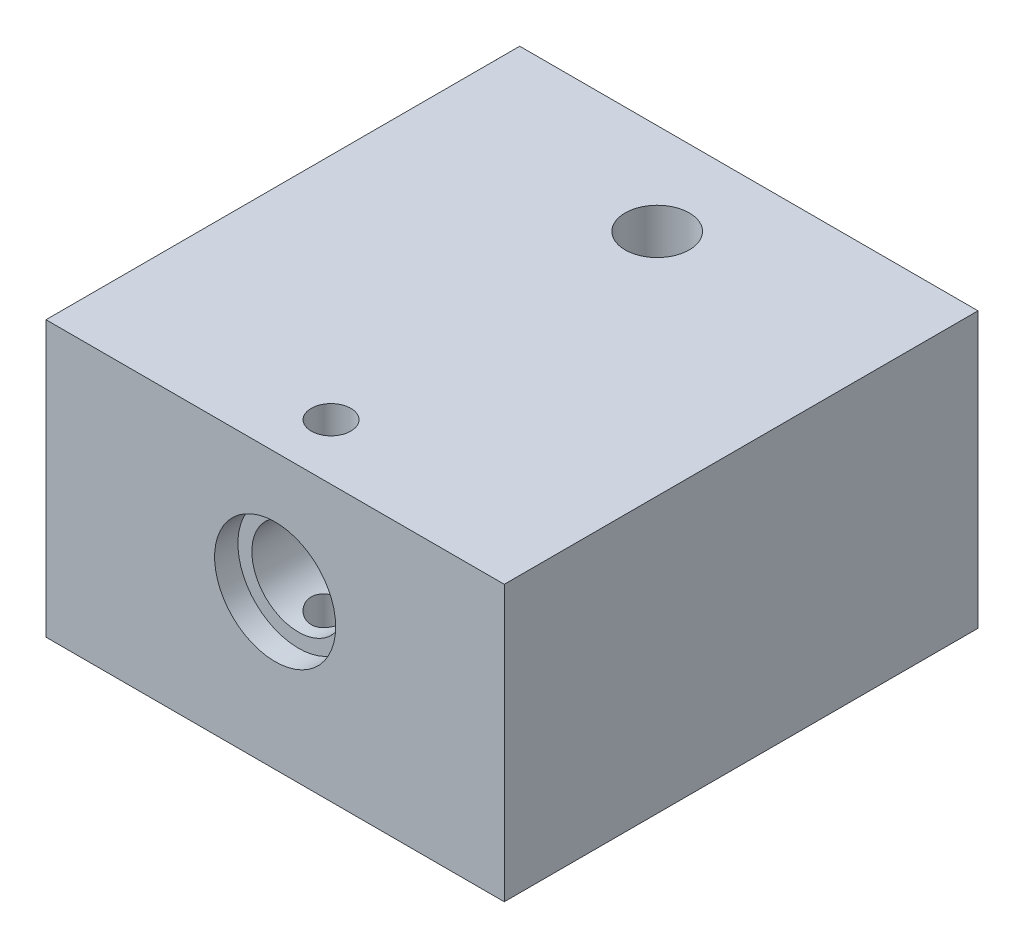
ISO-10303-21;
HEADER;
FILE_DESCRIPTION(('STEP AP214'),'2;1');
FILE_NAME('part.step','',(''),(''),'','','');
FILE_SCHEMA(('AUTOMOTIVE_DESIGN { 1 0 10303 214 1 1 1 1 }'));
ENDSEC;
DATA;
#1=APPLICATION_CONTEXT('core data for automotive mechanical design processes');
#2=APPLICATION_PROTOCOL_DEFINITION('international standard','automotive_design',2000,#1);
#3=PRODUCT_CONTEXT('',#1,'mechanical');
#4=PRODUCT('Part','Part','',(#3));
#5=PRODUCT_RELATED_PRODUCT_CATEGORY('part','',(#4));
#6=PRODUCT_DEFINITION_FORMATION('','',#4);
#7=PRODUCT_DEFINITION_CONTEXT('part definition',#1,'design');
#8=PRODUCT_DEFINITION('design','',#6,#7);
#9=PRODUCT_DEFINITION_SHAPE('','',#8);
#10=(LENGTH_UNIT() NAMED_UNIT(*) SI_UNIT(.MILLI.,.METRE.));
#11=(NAMED_UNIT(*) PLANE_ANGLE_UNIT() SI_UNIT($,.RADIAN.));
#12=(NAMED_UNIT(*) SI_UNIT($,.STERADIAN.) SOLID_ANGLE_UNIT());
#13=UNCERTAINTY_MEASURE_WITH_UNIT(LENGTH_MEASURE(1.E-05),#10,'distance_accuracy_value','');
#14=(GEOMETRIC_REPRESENTATION_CONTEXT(3) GLOBAL_UNCERTAINTY_ASSIGNED_CONTEXT((#13)) GLOBAL_UNIT_ASSIGNED_CONTEXT((#10,
#11,#12)) REPRESENTATION_CONTEXT('',''));
#15=CARTESIAN_POINT('',(0.,0.,0.));
#16=DIRECTION('',(0.,0.,1.));
#17=DIRECTION('',(1.,0.,0.));
#18=AXIS2_PLACEMENT_3D('',#15,#16,#17);
#19=CARTESIAN_POINT('',(-70.2377282776494,8.396,-56.7765959430233));
#20=DIRECTION('',(0.,0.,1.));
#21=DIRECTION('',(1.,0.,0.));
#22=AXIS2_PLACEMENT_3D('',#19,#20,#21);
#23=CYLINDRICAL_SURFACE('',#22,2.54);
#24=CARTESIAN_POINT('',(-70.2377282776494,5.85600000000001,-52.9030959430234));
#25=CARTESIAN_POINT('',(-70.2954540565278,5.85600494920879,-52.9031024767732));
#26=CARTESIAN_POINT('',(-70.3532654148404,5.85799049875809,-52.9077535295618));
#27=CARTESIAN_POINT('',(-70.4672451017373,5.86574176406517,-52.9261901695404));
#28=CARTESIAN_POINT('',(-70.5234088567018,5.87151712185038,-52.939999057043));
#29=CARTESIAN_POINT('',(-70.6322559483225,5.88622853633754,-52.976144809449));
#30=CARTESIAN_POINT('',(-70.6849505430987,5.89515370349126,-52.9984523137267));
#31=CARTESIAN_POINT('',(-70.7857967734474,5.91530072325419,-53.050838400811));
#32=CARTESIAN_POINT('',(-70.833949678348,5.92652193136205,-53.080914803499));
#33=CARTESIAN_POINT('',(-70.9269184608487,5.95079373890104,-53.1496286471514));
#34=CARTESIAN_POINT('',(-70.9714683660826,5.96390580222069,-53.1886040243645));
#35=CARTESIAN_POINT('',(-71.053629780163,5.99022163397866,-53.2732941637497));
#36=CARTESIAN_POINT('',(-71.0912374977554,6.00342544846394,-53.3190125840468));
#37=CARTESIAN_POINT('',(-71.1603700325742,6.02919524400095,-53.4187519693264));
#38=CARTESIAN_POINT('',(-71.1914801481277,6.04169301809848,-53.4730798659445));
#39=CARTESIAN_POINT('',(-71.2440016839835,6.06365562848929,-53.5868043819622));
#40=CARTESIAN_POINT('',(-71.2654182990281,6.07312208846476,-53.6461982661707));
#41=CARTESIAN_POINT('',(-71.2968353168137,6.0872822427673,-53.7653069340825));
#42=CARTESIAN_POINT('',(-71.3073487203862,6.09218914827286,-53.8248600535432));
#43=CARTESIAN_POINT('',(-71.318260031115,6.09728485738802,-53.9450716504944));
#44=CARTESIAN_POINT('',(-71.3186638460096,6.09747641650251,-54.0057294616943));
#45=CARTESIAN_POINT('',(-71.3097297541824,6.0932994842892,-54.1212210328693));
#46=CARTESIAN_POINT('',(-71.3011721731047,6.08929624305789,-54.1761310659081));
#47=CARTESIAN_POINT('',(-71.2758711000014,6.07780016063501,-54.2836457653623));
#48=CARTESIAN_POINT('',(-71.2591259644517,6.07030661883428,-54.3362499666068));
#49=CARTESIAN_POINT('',(-71.2175960458496,6.05250323019407,-54.4390154129461));
#50=CARTESIAN_POINT('',(-71.1926449059221,6.04213587255303,-54.4890990161583));
#51=CARTESIAN_POINT('',(-71.1355293873418,6.01976508174873,-54.5845683931012));
#52=CARTESIAN_POINT('',(-71.1033621015108,6.00776098995884,-54.6299522626433));
#53=CARTESIAN_POINT('',(-71.0293963948401,5.98218104392929,-54.7189502224163));
#54=CARTESIAN_POINT('',(-70.9869984917964,5.9685599779342,-54.7620545402123));
#55=CARTESIAN_POINT('',(-70.8954464717291,5.94217137358584,-54.8407162353623));
#56=CARTESIAN_POINT('',(-70.846290648008,5.92940405205832,-54.8762717004812));
#57=CARTESIAN_POINT('',(-70.7410155934028,5.90576310679323,-54.9396155749312));
#58=CARTESIAN_POINT('',(-70.6847534774818,5.89494453704248,-54.9671885962195));
#59=CARTESIAN_POINT('',(-70.5678117776416,5.87684609683171,-55.01229797408));
#60=CARTESIAN_POINT('',(-70.507134759068,5.86956418992569,-55.0298401075729));
#61=CARTESIAN_POINT('',(-70.3873388566134,5.85974473766644,-55.0533042151602));
#62=CARTESIAN_POINT('',(-70.3283767081008,5.85692858565955,-55.0599098168799));
#63=CARTESIAN_POINT('',(-70.2101236020373,5.85546262160095,-55.0633614204787));
#64=CARTESIAN_POINT('',(-70.1508327491963,5.85681155120561,-55.0602103700113));
#65=CARTESIAN_POINT('',(-70.0368599175699,5.863344538528,-55.0447203005117));
#66=CARTESIAN_POINT('',(-69.9820987300059,5.86832519075056,-55.0328683693606));
#67=CARTESIAN_POINT('',(-69.8754063884471,5.88139992359614,-55.0009987019312));
#68=CARTESIAN_POINT('',(-69.8234755892225,5.88949439349531,-54.9809799446524));
#69=CARTESIAN_POINT('',(-69.7220864853712,5.90833912047801,-54.9326934775513));
#70=CARTESIAN_POINT('',(-69.6727558425664,5.91916434677151,-54.9041879260995));
#71=CARTESIAN_POINT('',(-69.5794006076113,5.94232484236627,-54.8399974549462));
#72=CARTESIAN_POINT('',(-69.535378279594,5.95466075152289,-54.80430948896));
#73=CARTESIAN_POINT('',(-69.4504526045736,5.98065050656283,-54.7236727892713));
#74=CARTESIAN_POINT('',(-69.41002310147,5.99433422391665,-54.6782333734531));
#75=CARTESIAN_POINT('',(-69.3372230093117,6.02066999801151,-54.5810101575556));
#76=CARTESIAN_POINT('',(-69.3048545333148,6.03332178366637,-54.5292246992686));
#77=CARTESIAN_POINT('',(-69.2486641679409,6.05627933101312,-54.4195508625652));
#78=CARTESIAN_POINT('',(-69.2249949523224,6.0665421214838,-54.3615745912061));
#79=CARTESIAN_POINT('',(-69.1879639614265,6.08299048876205,-54.2418840818804));
#80=CARTESIAN_POINT('',(-69.1745932218376,6.08917961081131,-54.180173145344));
#81=CARTESIAN_POINT('',(-69.1594463432196,6.09622361078056,-54.0600442892869));
#82=CARTESIAN_POINT('',(-69.1568338527848,6.09746302488691,-54.0017539755865));
#83=CARTESIAN_POINT('',(-69.1610264496932,6.09549594358425,-53.8855956958247));
#84=CARTESIAN_POINT('',(-69.167829944289,6.09229020008923,-53.8277276599979));
#85=CARTESIAN_POINT('',(-69.1899495721853,6.0821514721074,-53.7170679132632));
#86=CARTESIAN_POINT('',(-69.2048196152982,6.07541438293386,-53.6641673308636));
#87=CARTESIAN_POINT('',(-69.2422041627093,6.05913347372727,-53.5616048711624));
#88=CARTESIAN_POINT('',(-69.2647208327984,6.04958885860779,-53.5119439161917));
#89=CARTESIAN_POINT('',(-69.3183496700888,6.0280418659045,-53.4139370520736));
#90=CARTESIAN_POINT('',(-69.3499049233527,6.01592451833445,-53.3658593730151));
#91=CARTESIAN_POINT('',(-69.4201082029689,5.99090435518685,-53.2754202378993));
#92=CARTESIAN_POINT('',(-69.4587588451518,5.97800125110364,-53.2330609000291));
#93=CARTESIAN_POINT('',(-69.5455872180403,5.95166959742402,-53.1518986813878));
#94=CARTESIAN_POINT('',(-69.5942695671853,5.93827716972638,-53.1136213389222));
#95=CARTESIAN_POINT('',(-69.6978561491365,5.91346695401537,-53.0457441093074));
#96=CARTESIAN_POINT('',(-69.7527631890217,5.90205006279754,-53.0161481588635));
#97=CARTESIAN_POINT('',(-69.8664829431401,5.88262485707599,-52.9670786524232));
#98=CARTESIAN_POINT('',(-69.9252235880253,5.87456736042331,-52.9474580451362));
#99=CARTESIAN_POINT('',(-70.0454837819946,5.86257078011983,-52.9185651054773));
#100=CARTESIAN_POINT('',(-70.1069940680855,5.85861889828967,-52.9092606091975));
#101=CARTESIAN_POINT('',(-70.1917464036084,5.8563104164033,-52.9038279127191));
#102=CARTESIAN_POINT('',(-70.2147305490664,5.85599802825423,-52.9030933400025));
#103=CARTESIAN_POINT('',(-70.2377282776494,5.85600000000001,-52.9030959430234));
#104=B_SPLINE_CURVE_WITH_KNOTS('',3,(#24,#25,#26,#27,#28,#29,#30,#31,#32,#33,#34,#35,#36,#37,
#38,#39,#40,#41,#42,#43,#44,#45,#46,#47,#48,#49,#50,#51,#52,#53,#54,#55,#56,#57,#58,#59,#60,#61,
#62,#63,#64,#65,#66,#67,#68,#69,#70,#71,#72,#73,#74,#75,#76,#77,#78,#79,#80,#81,#82,#83,#84,#85,
#86,#87,#88,#89,#90,#91,#92,#93,#94,#95,#96,#97,#98,#99,#100,#101,#102,#103),.UNSPECIFIED.,.T.,
.F.,(4,2,2,2,2,2,2,2,2,2,2,2,2,2,2,2,2,2,2,2,2,2,2,2,2,2,2,2,2,2,2,2,2,2,2,2,2,2,2,4),(0.,
0.173109941172708,0.346662025086488,0.519619888024115,0.692529267928441,0.873625999526105,
1.05482134060156,1.24537892761081,1.43583427363817,1.61685440897315,1.79776875913901,
1.96414317527464,2.13055100220202,2.30056491047797,2.47064743587895,2.65574212649886,
2.84088364852489,3.03063409980791,3.22027516095429,3.39754013167782,3.57475155280992,
3.74273321092933,3.91073587622433,4.08397929751029,4.2572963521437,4.44347432982146,
4.62970105956507,4.81905553672168,5.00824500335979,5.18241214565643,5.35654983056323,
5.52191530708961,5.68732765999135,5.86290227537949,6.0385417496761,6.2277149160178,
6.41697373357776,6.60335522726164,6.78915396607244,6.85812030172787),.UNSPECIFIED.);
#105=CARTESIAN_POINT('',(-70.2377282776494,5.85600000000001,-52.9030959430234));
#106=VERTEX_POINT('',#105);
#107=EDGE_CURVE('E119',#106,#106,#104,.T.);
#108=ORIENTED_EDGE('',*,*,#107,.T.);
#109=EDGE_LOOP('',(#108));
#110=FACE_BOUND('',#109,.T.);
#111=CARTESIAN_POINT('',(-70.2377282776494,10.936,-52.9030959430234));
#112=CARTESIAN_POINT('',(-70.1800024987709,10.9359950507912,-52.9031024767732));
#113=CARTESIAN_POINT('',(-70.1221911404584,10.9340095012419,-52.9077535295618));
#114=CARTESIAN_POINT('',(-70.0082114535614,10.9262582359348,-52.9261901695404));
#115=CARTESIAN_POINT('',(-69.9520476985969,10.9204828781496,-52.939999057043));
#116=CARTESIAN_POINT('',(-69.8432006069763,10.9057714636625,-52.976144809449));
#117=CARTESIAN_POINT('',(-69.7905060122001,10.8968462965087,-52.9984523137267));
#118=CARTESIAN_POINT('',(-69.6896597818513,10.8766992767458,-53.050838400811));
#119=CARTESIAN_POINT('',(-69.6415068769507,10.865478068638,-53.080914803499));
#120=CARTESIAN_POINT('',(-69.54853809445,10.841206261099,-53.1496286471514));
#121=CARTESIAN_POINT('',(-69.5039881892161,10.8280941977793,-53.1886040243645));
#122=CARTESIAN_POINT('',(-69.4218267751357,10.8017783660213,-53.2732941637497));
#123=CARTESIAN_POINT('',(-69.3842190575433,10.7885745515361,-53.3190125840468));
#124=CARTESIAN_POINT('',(-69.3150865227245,10.7628047559991,-53.4187519693264));
#125=CARTESIAN_POINT('',(-69.283976407171,10.7503069819015,-53.4730798659445));
#126=CARTESIAN_POINT('',(-69.2314548713152,10.7283443715107,-53.5868043819622));
#127=CARTESIAN_POINT('',(-69.2100382562706,10.7188779115352,-53.6461982661707));
#128=CARTESIAN_POINT('',(-69.1786212384851,10.7047177572327,-53.7653069340825));
#129=CARTESIAN_POINT('',(-69.1681078349125,10.6998108517271,-53.8248600535432));
#130=CARTESIAN_POINT('',(-69.1571965241837,10.694715142612,-53.9450716504944));
#131=CARTESIAN_POINT('',(-69.1567927092892,10.6945235834975,-54.0057294616943));
#132=CARTESIAN_POINT('',(-69.1657268011163,10.6987005157108,-54.1212210328693));
#133=CARTESIAN_POINT('',(-69.174284382194,10.7027037569421,-54.1761310659081));
#134=CARTESIAN_POINT('',(-69.1995854552973,10.714199839365,-54.2836457653623));
#135=CARTESIAN_POINT('',(-69.216330590847,10.7216933811657,-54.3362499666068));
#136=CARTESIAN_POINT('',(-69.2578605094491,10.7394967698059,-54.4390154129461));
#137=CARTESIAN_POINT('',(-69.2828116493766,10.749864127447,-54.4890990161583));
#138=CARTESIAN_POINT('',(-69.339927167957,10.7722349182513,-54.5845683931012));
#139=CARTESIAN_POINT('',(-69.372094453788,10.7842390100412,-54.6299522626433));
#140=CARTESIAN_POINT('',(-69.4460601604586,10.8098189560707,-54.7189502224163));
#141=CARTESIAN_POINT('',(-69.4884580635023,10.8234400220658,-54.7620545402123));
#142=CARTESIAN_POINT('',(-69.5800100835696,10.8498286264142,-54.8407162353623));
#143=CARTESIAN_POINT('',(-69.6291659072907,10.8625959479417,-54.8762717004812));
#144=CARTESIAN_POINT('',(-69.7344409618959,10.8862368932068,-54.9396155749312));
#145=CARTESIAN_POINT('',(-69.7907030778169,10.8970554629575,-54.9671885962195));
#146=CARTESIAN_POINT('',(-69.9076447776572,10.9151539031683,-55.01229797408));
#147=CARTESIAN_POINT('',(-69.9683217962307,10.9224358100743,-55.0298401075729));
#148=CARTESIAN_POINT('',(-70.0881176986854,10.9322552623336,-55.0533042151602));
#149=CARTESIAN_POINT('',(-70.1470798471979,10.9350714143405,-55.0599098168799));
#150=CARTESIAN_POINT('',(-70.2653329532614,10.9365373783991,-55.0633614204787));
#151=CARTESIAN_POINT('',(-70.3246238061024,10.9351884487944,-55.0602103700113));
#152=CARTESIAN_POINT('',(-70.4385966377288,10.928655461472,-55.0447203005117));
#153=CARTESIAN_POINT('',(-70.4933578252928,10.9236748092494,-55.0328683693606));
#154=CARTESIAN_POINT('',(-70.6000501668516,10.9106000764039,-55.0009987019312));
#155=CARTESIAN_POINT('',(-70.6519809660762,10.9025056065047,-54.9809799446524));
#156=CARTESIAN_POINT('',(-70.7533700699275,10.883660879522,-54.9326934775513));
#157=CARTESIAN_POINT('',(-70.8027007127324,10.8728356532285,-54.9041879260995));
#158=CARTESIAN_POINT('',(-70.8960559476875,10.8496751576337,-54.8399974549462));
#159=CARTESIAN_POINT('',(-70.9400782757048,10.8373392484771,-54.80430948896));
#160=CARTESIAN_POINT('',(-71.0250039507251,10.8113494934372,-54.7236727892713));
#161=CARTESIAN_POINT('',(-71.0654334538287,10.7976657760834,-54.6782333734531));
#162=CARTESIAN_POINT('',(-71.138233545987,10.7713300019885,-54.5810101575556));
#163=CARTESIAN_POINT('',(-71.1706020219839,10.7586782163336,-54.5292246992686));
#164=CARTESIAN_POINT('',(-71.2267923873578,10.7357206689869,-54.4195508625652));
#165=CARTESIAN_POINT('',(-71.2504616029764,10.7254578785162,-54.3615745912061));
#166=CARTESIAN_POINT('',(-71.2874925938722,10.709009511238,-54.2418840818804));
#167=CARTESIAN_POINT('',(-71.3008633334611,10.7028203891887,-54.180173145344));
#168=CARTESIAN_POINT('',(-71.3160102120791,10.6957763892194,-54.0600442892869));
#169=CARTESIAN_POINT('',(-71.3186227025139,10.6945369751131,-54.0017539755865));
#170=CARTESIAN_POINT('',(-71.3144301056056,10.6965040564158,-53.8855956958247));
#171=CARTESIAN_POINT('',(-71.3076266110097,10.6997097999108,-53.8277276599979));
#172=CARTESIAN_POINT('',(-71.2855069831134,10.7098485278926,-53.7170679132632));
#173=CARTESIAN_POINT('',(-71.2706369400005,10.7165856170661,-53.6641673308636));
#174=CARTESIAN_POINT('',(-71.2332523925894,10.7328665262727,-53.5616048711624));
#175=CARTESIAN_POINT('',(-71.2107357225003,10.7424111413922,-53.5119439161917));
#176=CARTESIAN_POINT('',(-71.1571068852099,10.7639581340955,-53.4139370520736));
#177=CARTESIAN_POINT('',(-71.125551631946,10.7760754816656,-53.3658593730151));
#178=CARTESIAN_POINT('',(-71.0553483523298,10.8010956448131,-53.2754202378993));
#179=CARTESIAN_POINT('',(-71.0166977101469,10.8139987488964,-53.2330609000291));
#180=CARTESIAN_POINT('',(-70.9298693372584,10.840330402576,-53.1518986813878));
#181=CARTESIAN_POINT('',(-70.8811869881135,10.8537228302736,-53.1136213389222));
#182=CARTESIAN_POINT('',(-70.7776004061622,10.8785330459846,-53.0457441093074));
#183=CARTESIAN_POINT('',(-70.722693366277,10.8899499372025,-53.0161481588635));
#184=CARTESIAN_POINT('',(-70.6089736121586,10.909375142924,-52.9670786524232));
#185=CARTESIAN_POINT('',(-70.5502329672734,10.9174326395767,-52.9474580451362));
#186=CARTESIAN_POINT('',(-70.4299727733041,10.9294292198802,-52.9185651054773));
#187=CARTESIAN_POINT('',(-70.3684624872132,10.9333811017103,-52.9092606091975));
#188=CARTESIAN_POINT('',(-70.2837101516903,10.9356895835967,-52.9038279127191));
#189=CARTESIAN_POINT('',(-70.2607260062323,10.9360019717458,-52.9030933400025));
#190=CARTESIAN_POINT('',(-70.2377282776494,10.936,-52.9030959430234));
#191=B_SPLINE_CURVE_WITH_KNOTS('',3,(#111,#112,#113,#114,#115,#116,#117,#118,#119,#120,#121,
#122,#123,#124,#125,#126,#127,#128,#129,#130,#131,#132,#133,#134,#135,#136,#137,#138,#139,#140,
#141,#142,#143,#144,#145,#146,#147,#148,#149,#150,#151,#152,#153,#154,#155,#156,#157,#158,#159,
#160,#161,#162,#163,#164,#165,#166,#167,#168,#169,#170,#171,#172,#173,#174,#175,#176,#177,#178,
#179,#180,#181,#182,#183,#184,#185,#186,#187,#188,#189,#190),.UNSPECIFIED.,.T.,.F.,(4,2,2,2,2,2,
2,2,2,2,2,2,2,2,2,2,2,2,2,2,2,2,2,2,2,2,2,2,2,2,2,2,2,2,2,2,2,2,2,4),(0.,0.173109941172722,
0.346662025086487,0.519619888024099,0.69252926792844,0.873625999526089,1.05482134060156,
1.2453789276108,1.43583427363817,1.61685440897315,1.79776875913901,1.96414317527464,
2.13055100220202,2.30056491047796,2.47064743587894,2.65574212649886,2.84088364852489,
3.03063409980793,3.22027516095429,3.39754013167783,3.57475155280992,3.74273321092933,
3.91073587622433,4.0839792975103,4.2572963521437,4.44347432982144,4.62970105956507,
4.81905553672167,5.00824500335979,5.18241214565644,5.35654983056323,5.52191530708961,
5.68732765999135,5.86290227537949,6.0385417496761,6.22771491601779,6.41697373357776,
6.60335522726165,6.78915396607244,6.85812030172787),.UNSPECIFIED.);
#192=CARTESIAN_POINT('',(-70.2377282776494,10.936,-52.9030959430234));
#193=VERTEX_POINT('',#192);
#194=EDGE_CURVE('E110',#193,#193,#191,.T.);
#195=ORIENTED_EDGE('',*,*,#194,.T.);
#196=EDGE_LOOP('',(#195));
#197=FACE_BOUND('',#196,.T.);
#198=CARTESIAN_POINT('',(-70.2377282776494,8.396,-56.7765959430233));
#199=DIRECTION('',(0.,0.,1.));
#200=DIRECTION('',(1.,0.,0.));
#201=AXIS2_PLACEMENT_3D('',#198,#199,#200);
#202=CIRCLE('',#201,2.54);
#203=CARTESIAN_POINT('',(-67.6977282776494,8.396,-56.7765959430233));
#204=VERTEX_POINT('',#203);
#205=EDGE_CURVE('E161',#204,#204,#202,.T.);
#206=ORIENTED_EDGE('',*,*,#205,.F.);
#207=EDGE_LOOP('',(#206));
#208=FACE_BOUND('',#207,.T.);
#209=CARTESIAN_POINT('',(-70.2377282776494,8.396,-52.2045959430234));
#210=DIRECTION('',(0.,0.,1.));
#211=DIRECTION('',(1.,0.,0.));
#212=AXIS2_PLACEMENT_3D('',#209,#210,#211);
#213=CIRCLE('',#212,2.54);
#214=CARTESIAN_POINT('',(-67.6977282776494,8.396,-52.2045959430234));
#215=VERTEX_POINT('',#214);
#216=EDGE_CURVE('E37',#215,#215,#213,.F.);
#217=ORIENTED_EDGE('',*,*,#216,.F.);
#218=EDGE_LOOP('',(#217));
#219=FACE_BOUND('',#218,.T.);
#220=ADVANCED_FACE('F33',(#110,#197,#208,#219),#23,.F.);
#221=CARTESIAN_POINT('',(-82.7377282776494,15.,-56.7765959430233));
#222=DIRECTION('',(1.,0.,0.));
#223=DIRECTION('',(0.,0.,-1.));
#224=AXIS2_PLACEMENT_3D('',#221,#222,#223);
#225=PLANE('',#224);
#226=DIRECTION('',(0.,0.,1.));
#227=VECTOR('',#226,1.);
#228=CARTESIAN_POINT('',(-82.7377282776494,0.,-56.7765959430233));
#229=LINE('',#228,#227);
#230=CARTESIAN_POINT('',(-82.7377282776494,0.,-76.7765959430233));
#231=VERTEX_POINT('',#230);
#232=CARTESIAN_POINT('',(-82.7377282776494,0.,-50.9345959430233));
#233=VERTEX_POINT('',#232);
#234=EDGE_CURVE('E89',#231,#233,#229,.T.);
#235=ORIENTED_EDGE('',*,*,#234,.T.);
#236=DIRECTION('',(0.,-1.,0.));
#237=VECTOR('',#236,1.);
#238=CARTESIAN_POINT('',(-82.7377282776494,15.,-50.9345959430233));
#239=LINE('',#238,#237);
#240=CARTESIAN_POINT('',(-82.7377282776494,15.,-50.9345959430233));
#241=VERTEX_POINT('',#240);
#242=EDGE_CURVE('E11',#241,#233,#239,.T.);
#243=ORIENTED_EDGE('',*,*,#242,.F.);
#244=DIRECTION('',(0.,0.,1.));
#245=VECTOR('',#244,1.);
#246=CARTESIAN_POINT('',(-82.7377282776494,15.,-56.7765959430233));
#247=LINE('',#246,#245);
#248=CARTESIAN_POINT('',(-82.7377282776494,15.,-76.7765959430233));
#249=VERTEX_POINT('',#248);
#250=EDGE_CURVE('E83',#249,#241,#247,.T.);
#251=ORIENTED_EDGE('',*,*,#250,.F.);
#252=DIRECTION('',(0.,1.,0.));
#253=VECTOR('',#252,1.);
#254=CARTESIAN_POINT('',(-82.7377282776494,0.,-76.7765959430233));
#255=LINE('',#254,#253);
#256=EDGE_CURVE('E93',#231,#249,#255,.T.);
#257=ORIENTED_EDGE('',*,*,#256,.F.);
#258=EDGE_LOOP('',(#235,#243,#251,#257));
#259=FACE_BOUND('',#258,.T.);
#260=ADVANCED_FACE('F35',(#259),#225,.F.);
#261=CARTESIAN_POINT('',(-82.7377282776494,15.,-50.9345959430233));
#262=DIRECTION('',(0.,0.,-1.));
#263=DIRECTION('',(-1.,0.,0.));
#264=AXIS2_PLACEMENT_3D('',#261,#262,#263);
#265=PLANE('',#264);
#266=CARTESIAN_POINT('',(-70.2377282776494,8.396,-50.9345959430234));
#267=DIRECTION('',(0.,0.,1.));
#268=DIRECTION('',(1.,0.,0.));
#269=AXIS2_PLACEMENT_3D('',#266,#267,#268);
#270=CIRCLE('',#269,3.302);
#271=CARTESIAN_POINT('',(-66.9357282776494,8.396,-50.9345959430234));
#272=VERTEX_POINT('',#271);
#273=EDGE_CURVE('E168',#272,#272,#270,.T.);
#274=ORIENTED_EDGE('',*,*,#273,.F.);
#275=EDGE_LOOP('',(#274));
#276=FACE_BOUND('',#275,.T.);
#277=DIRECTION('',(1.,0.,0.));
#278=VECTOR('',#277,1.);
#279=CARTESIAN_POINT('',(-82.7377282776494,0.,-50.9345959430233));
#280=LINE('',#279,#278);
#281=CARTESIAN_POINT('',(-57.7377282776494,0.,-50.9345959430234));
#282=VERTEX_POINT('',#281);
#283=EDGE_CURVE('E62',#233,#282,#280,.T.);
#284=ORIENTED_EDGE('',*,*,#283,.T.);
#285=DIRECTION('',(0.,-1.,0.));
#286=VECTOR('',#285,1.);
#287=CARTESIAN_POINT('',(-57.7377282776494,15.,-50.9345959430234));
#288=LINE('',#287,#286);
#289=CARTESIAN_POINT('',(-57.7377282776494,15.,-50.9345959430234));
#290=VERTEX_POINT('',#289);
#291=EDGE_CURVE('E43',#290,#282,#288,.T.);
#292=ORIENTED_EDGE('',*,*,#291,.F.);
#293=DIRECTION('',(1.,0.,0.));
#294=VECTOR('',#293,1.);
#295=CARTESIAN_POINT('',(-82.7377282776494,15.,-50.9345959430233));
#296=LINE('',#295,#294);
#297=EDGE_CURVE('E51',#241,#290,#296,.T.);
#298=ORIENTED_EDGE('',*,*,#297,.F.);
#299=ORIENTED_EDGE('',*,*,#242,.T.);
#300=EDGE_LOOP('',(#284,#292,#298,#299));
#301=FACE_BOUND('',#300,.T.);
#302=ADVANCED_FACE('F151',(#276,#301),#265,.F.);
#303=CARTESIAN_POINT('',(-57.7377282776494,15.,-56.7765959430233));
#304=DIRECTION('',(-1.,0.,0.));
#305=DIRECTION('',(0.,0.,1.));
#306=AXIS2_PLACEMENT_3D('',#303,#304,#305);
#307=PLANE('',#306);
#308=DIRECTION('',(0.,0.,-1.));
#309=VECTOR('',#308,1.);
#310=CARTESIAN_POINT('',(-57.7377282776494,0.,-56.7765959430233));
#311=LINE('',#310,#309);
#312=CARTESIAN_POINT('',(-57.7377282776494,0.,-76.7765959430233));
#313=VERTEX_POINT('',#312);
#314=EDGE_CURVE('E78',#282,#313,#311,.T.);
#315=ORIENTED_EDGE('',*,*,#314,.T.);
#316=DIRECTION('',(0.,-1.,0.));
#317=VECTOR('',#316,1.);
#318=CARTESIAN_POINT('',(-57.7377282776494,0.,-76.7765959430233));
#319=LINE('',#318,#317);
#320=CARTESIAN_POINT('',(-57.7377282776494,15.,-76.7765959430233));
#321=VERTEX_POINT('',#320);
#322=EDGE_CURVE('E82',#321,#313,#319,.T.);
#323=ORIENTED_EDGE('',*,*,#322,.F.);
#324=DIRECTION('',(0.,0.,-1.));
#325=VECTOR('',#324,1.);
#326=CARTESIAN_POINT('',(-57.7377282776494,15.,-56.7765959430233));
#327=LINE('',#326,#325);
#328=EDGE_CURVE('E66',#290,#321,#327,.T.);
#329=ORIENTED_EDGE('',*,*,#328,.F.);
#330=ORIENTED_EDGE('',*,*,#291,.T.);
#331=EDGE_LOOP('',(#315,#323,#329,#330));
#332=FACE_BOUND('',#331,.T.);
#333=ADVANCED_FACE('F80',(#332),#307,.F.);
#334=CARTESIAN_POINT('',(0.,15.,0.));
#335=DIRECTION('',(0.,1.,0.));
#336=DIRECTION('',(0.,0.,1.));
#337=AXIS2_PLACEMENT_3D('',#334,#335,#336);
#338=PLANE('',#337);
#339=CARTESIAN_POINT('',(-70.2377282776494,15.,-71.7765959430233));
#340=DIRECTION('',(0.,1.,0.));
#341=DIRECTION('',(0.,0.,1.));
#342=AXIS2_PLACEMENT_3D('',#339,#340,#341);
#343=CIRCLE('',#342,1.75);
#344=CARTESIAN_POINT('',(-70.2377282776494,15.,-70.0265959430233));
#345=VERTEX_POINT('',#344);
#346=EDGE_CURVE('E100',#345,#345,#343,.T.);
#347=ORIENTED_EDGE('',*,*,#346,.F.);
#348=EDGE_LOOP('',(#347));
#349=FACE_BOUND('',#348,.T.);
#350=CARTESIAN_POINT('',(-70.2377282776494,15.,-53.9825959430234));
#351=DIRECTION('',(0.,1.,0.));
#352=DIRECTION('',(0.,0.,1.));
#353=AXIS2_PLACEMENT_3D('',#350,#351,#352);
#354=CIRCLE('',#353,1.0795);
#355=CARTESIAN_POINT('',(-70.2377282776494,15.,-52.9030959430234));
#356=VERTEX_POINT('',#355);
#357=EDGE_CURVE('E106',#356,#356,#354,.T.);
#358=ORIENTED_EDGE('',*,*,#357,.F.);
#359=EDGE_LOOP('',(#358));
#360=FACE_BOUND('',#359,.T.);
#361=ORIENTED_EDGE('',*,*,#250,.T.);
#362=ORIENTED_EDGE('',*,*,#297,.T.);
#363=ORIENTED_EDGE('',*,*,#328,.T.);
#364=DIRECTION('',(1.,0.,0.));
#365=VECTOR('',#364,1.);
#366=CARTESIAN_POINT('',(-57.7377282776494,15.,-76.7765959430233));
#367=LINE('',#366,#365);
#368=EDGE_CURVE('E96',#249,#321,#367,.T.);
#369=ORIENTED_EDGE('',*,*,#368,.F.);
#370=EDGE_LOOP('',(#361,#362,#363,#369));
#371=FACE_BOUND('',#370,.T.);
#372=ADVANCED_FACE('F179',(#349,#360,#371),#338,.T.);
#373=CARTESIAN_POINT('',(0.,0.,0.));
#374=DIRECTION('',(0.,1.,0.));
#375=DIRECTION('',(0.,0.,1.));
#376=AXIS2_PLACEMENT_3D('',#373,#374,#375);
#377=PLANE('',#376);
#378=CARTESIAN_POINT('',(-70.2377282776494,0.,-71.7765959430233));
#379=DIRECTION('',(0.,1.,0.));
#380=DIRECTION('',(0.,0.,1.));
#381=AXIS2_PLACEMENT_3D('',#378,#379,#380);
#382=CIRCLE('',#381,1.75);
#383=CARTESIAN_POINT('',(-70.2377282776494,0.,-70.0265959430233));
#384=VERTEX_POINT('',#383);
#385=EDGE_CURVE('E97',#384,#384,#382,.T.);
#386=ORIENTED_EDGE('',*,*,#385,.T.);
#387=EDGE_LOOP('',(#386));
#388=FACE_BOUND('',#387,.T.);
#389=CARTESIAN_POINT('',(-70.2377282776494,0.,-53.9825959430234));
#390=DIRECTION('',(0.,1.,0.));
#391=DIRECTION('',(0.,0.,1.));
#392=AXIS2_PLACEMENT_3D('',#389,#390,#391);
#393=CIRCLE('',#392,1.0795);
#394=CARTESIAN_POINT('',(-70.2377282776494,0.,-52.9030959430234));
#395=VERTEX_POINT('',#394);
#396=EDGE_CURVE('E107',#395,#395,#393,.T.);
#397=ORIENTED_EDGE('',*,*,#396,.T.);
#398=EDGE_LOOP('',(#397));
#399=FACE_BOUND('',#398,.T.);
#400=ORIENTED_EDGE('',*,*,#234,.F.);
#401=DIRECTION('',(-1.,0.,0.));
#402=VECTOR('',#401,1.);
#403=CARTESIAN_POINT('',(-57.7377282776494,0.,-76.7765959430233));
#404=LINE('',#403,#402);
#405=EDGE_CURVE('E86',#313,#231,#404,.T.);
#406=ORIENTED_EDGE('',*,*,#405,.F.);
#407=ORIENTED_EDGE('',*,*,#314,.F.);
#408=ORIENTED_EDGE('',*,*,#283,.F.);
#409=EDGE_LOOP('',(#400,#406,#407,#408));
#410=FACE_BOUND('',#409,.T.);
#411=ADVANCED_FACE('F87',(#388,#399,#410),#377,.F.);
#412=CARTESIAN_POINT('',(-70.2377282776494,8.396,-52.2045959430234));
#413=DIRECTION('',(0.,0.,1.));
#414=DIRECTION('',(1.,0.,0.));
#415=AXIS2_PLACEMENT_3D('',#412,#413,#414);
#416=PLANE('',#415);
#417=CARTESIAN_POINT('',(-70.2377282776494,8.396,-52.2045959430234));
#418=DIRECTION('',(0.,0.,1.));
#419=DIRECTION('',(1.,0.,0.));
#420=AXIS2_PLACEMENT_3D('',#417,#418,#419);
#421=CIRCLE('',#420,3.302);
#422=CARTESIAN_POINT('',(-66.9357282776494,8.396,-52.2045959430234));
#423=VERTEX_POINT('',#422);
#424=EDGE_CURVE('E165',#423,#423,#421,.T.);
#425=ORIENTED_EDGE('',*,*,#424,.T.);
#426=EDGE_LOOP('',(#425));
#427=FACE_BOUND('',#426,.T.);
#428=ORIENTED_EDGE('',*,*,#216,.T.);
#429=EDGE_LOOP('',(#428));
#430=FACE_BOUND('',#429,.T.);
#431=ADVANCED_FACE('F136',(#427,#430),#416,.T.);
#432=CARTESIAN_POINT('',(-70.2377282776494,8.396,-52.2045959430234));
#433=DIRECTION('',(0.,0.,1.));
#434=DIRECTION('',(1.,0.,0.));
#435=AXIS2_PLACEMENT_3D('',#432,#433,#434);
#436=CYLINDRICAL_SURFACE('',#435,3.302);
#437=ORIENTED_EDGE('',*,*,#424,.F.);
#438=EDGE_LOOP('',(#437));
#439=FACE_BOUND('',#438,.T.);
#440=ORIENTED_EDGE('',*,*,#273,.T.);
#441=EDGE_LOOP('',(#440));
#442=FACE_BOUND('',#441,.T.);
#443=ADVANCED_FACE('F132',(#439,#442),#436,.F.);
#444=CARTESIAN_POINT('',(-70.2377282776494,0.,-53.9825959430234));
#445=DIRECTION('',(0.,1.,0.));
#446=DIRECTION('',(0.,0.,1.));
#447=AXIS2_PLACEMENT_3D('',#444,#445,#446);
#448=CYLINDRICAL_SURFACE('',#447,1.0795);
#449=ORIENTED_EDGE('',*,*,#396,.F.);
#450=EDGE_LOOP('',(#449));
#451=FACE_BOUND('',#450,.T.);
#452=ORIENTED_EDGE('',*,*,#107,.F.);
#453=EDGE_LOOP('',(#452));
#454=FACE_BOUND('',#453,.T.);
#455=ADVANCED_FACE('F126',(#451,#454),#448,.F.);
#456=ORIENTED_EDGE('',*,*,#357,.T.);
#457=EDGE_LOOP('',(#456));
#458=FACE_BOUND('',#457,.T.);
#459=ORIENTED_EDGE('',*,*,#194,.F.);
#460=EDGE_LOOP('',(#459));
#461=FACE_BOUND('',#460,.T.);
#462=ADVANCED_FACE('F131',(#458,#461),#448,.F.);
#463=CARTESIAN_POINT('',(0.,0.,-76.7765959430233));
#464=DIRECTION('',(0.,0.,1.));
#465=DIRECTION('',(1.,0.,0.));
#466=AXIS2_PLACEMENT_3D('',#463,#464,#465);
#467=PLANE('',#466);
#468=ORIENTED_EDGE('',*,*,#322,.T.);
#469=ORIENTED_EDGE('',*,*,#405,.T.);
#470=ORIENTED_EDGE('',*,*,#256,.T.);
#471=ORIENTED_EDGE('',*,*,#368,.T.);
#472=EDGE_LOOP('',(#468,#469,#470,#471));
#473=FACE_BOUND('',#472,.T.);
#474=ADVANCED_FACE('F95',(#473),#467,.F.);
#475=CARTESIAN_POINT('',(0.,0.,-56.7765959430233));
#476=DIRECTION('',(0.,0.,1.));
#477=DIRECTION('',(1.,0.,0.));
#478=AXIS2_PLACEMENT_3D('',#475,#476,#477);
#479=PLANE('',#478);
#480=ORIENTED_EDGE('',*,*,#205,.T.);
#481=EDGE_LOOP('',(#480));
#482=FACE_BOUND('',#481,.T.);
#483=ADVANCED_FACE('F134',(#482),#479,.T.);
#484=CARTESIAN_POINT('',(-70.2377282776494,0.,-71.7765959430233));
#485=DIRECTION('',(0.,1.,0.));
#486=DIRECTION('',(0.,0.,1.));
#487=AXIS2_PLACEMENT_3D('',#484,#485,#486);
#488=CYLINDRICAL_SURFACE('',#487,1.75);
#489=ORIENTED_EDGE('',*,*,#385,.F.);
#490=EDGE_LOOP('',(#489));
#491=FACE_BOUND('',#490,.T.);
#492=ORIENTED_EDGE('',*,*,#346,.T.);
#493=EDGE_LOOP('',(#492));
#494=FACE_BOUND('',#493,.T.);
#495=ADVANCED_FACE('F225',(#491,#494),#488,.F.);
#496=CLOSED_SHELL('',(#220,#260,#302,#333,#372,#411,#431,#443,#455,#462,#474,#483,#495));
#497=MANIFOLD_SOLID_BREP('B2',#496);
#498=ADVANCED_BREP_SHAPE_REPRESENTATION('',(#18,#497),#14);
#499=SHAPE_DEFINITION_REPRESENTATION(#9,#498);
ENDSEC;
END-ISO-10303-21;
